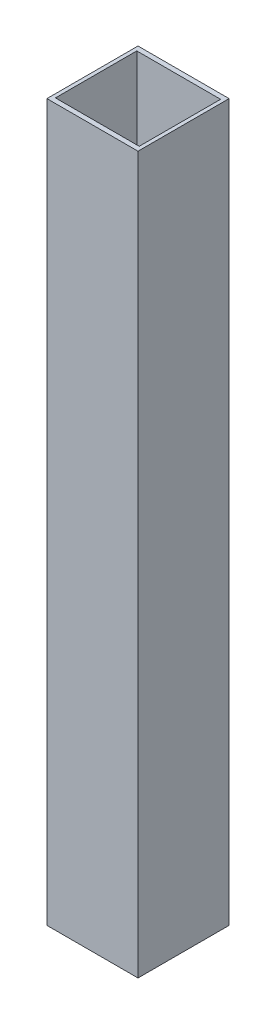
ISO-10303-21;
HEADER;
FILE_DESCRIPTION(('STEP AP214'),'2;1');
FILE_NAME('part.step','',(''),(''),'','','');
FILE_SCHEMA(('AUTOMOTIVE_DESIGN { 1 0 10303 214 1 1 1 1 }'));
ENDSEC;
DATA;
#1=APPLICATION_CONTEXT('core data for automotive mechanical design processes');
#2=APPLICATION_PROTOCOL_DEFINITION('international standard','automotive_design',2000,#1);
#3=PRODUCT_CONTEXT('',#1,'mechanical');
#4=PRODUCT('Part','Part','',(#3));
#5=PRODUCT_RELATED_PRODUCT_CATEGORY('part','',(#4));
#6=PRODUCT_DEFINITION_FORMATION('','',#4);
#7=PRODUCT_DEFINITION_CONTEXT('part definition',#1,'design');
#8=PRODUCT_DEFINITION('design','',#6,#7);
#9=PRODUCT_DEFINITION_SHAPE('','',#8);
#10=(LENGTH_UNIT() NAMED_UNIT(*) SI_UNIT(.MILLI.,.METRE.));
#11=(NAMED_UNIT(*) PLANE_ANGLE_UNIT() SI_UNIT($,.RADIAN.));
#12=(NAMED_UNIT(*) SI_UNIT($,.STERADIAN.) SOLID_ANGLE_UNIT());
#13=UNCERTAINTY_MEASURE_WITH_UNIT(LENGTH_MEASURE(1.E-05),#10,'distance_accuracy_value','');
#14=(GEOMETRIC_REPRESENTATION_CONTEXT(3) GLOBAL_UNCERTAINTY_ASSIGNED_CONTEXT((#13)) GLOBAL_UNIT_ASSIGNED_CONTEXT((#10,
#11,#12)) REPRESENTATION_CONTEXT('',''));
#15=CARTESIAN_POINT('',(0.,0.,0.));
#16=DIRECTION('',(0.,0.,1.));
#17=DIRECTION('',(1.,0.,0.));
#18=AXIS2_PLACEMENT_3D('',#15,#16,#17);
#19=CARTESIAN_POINT('',(0.,117.91,0.));
#20=DIRECTION('',(0.,1.,0.));
#21=DIRECTION('',(0.,0.,1.));
#22=AXIS2_PLACEMENT_3D('',#19,#20,#21);
#23=PLANE('',#22);
#24=DIRECTION('',(0.,0.,1.));
#25=VECTOR('',#24,1.);
#26=CARTESIAN_POINT('',(-7.5,117.91,7.5));
#27=LINE('',#26,#25);
#28=CARTESIAN_POINT('',(-7.5,117.91,-7.5));
#29=VERTEX_POINT('',#28);
#30=CARTESIAN_POINT('',(-7.5,117.91,7.5));
#31=VERTEX_POINT('',#30);
#32=EDGE_CURVE('E135',#29,#31,#27,.T.);
#33=ORIENTED_EDGE('',*,*,#32,.T.);
#34=DIRECTION('',(1.,0.,0.));
#35=VECTOR('',#34,1.);
#36=CARTESIAN_POINT('',(7.5,117.91,7.5));
#37=LINE('',#36,#35);
#38=CARTESIAN_POINT('',(7.5,117.91,7.5));
#39=VERTEX_POINT('',#38);
#40=EDGE_CURVE('E138',#31,#39,#37,.T.);
#41=ORIENTED_EDGE('',*,*,#40,.T.);
#42=DIRECTION('',(0.,0.,-1.));
#43=VECTOR('',#42,1.);
#44=CARTESIAN_POINT('',(7.5,117.91,7.5));
#45=LINE('',#44,#43);
#46=CARTESIAN_POINT('',(7.5,117.91,-7.5));
#47=VERTEX_POINT('',#46);
#48=EDGE_CURVE('E141',#39,#47,#45,.T.);
#49=ORIENTED_EDGE('',*,*,#48,.T.);
#50=DIRECTION('',(-1.,0.,0.));
#51=VECTOR('',#50,1.);
#52=CARTESIAN_POINT('',(7.5,117.91,-7.5));
#53=LINE('',#52,#51);
#54=EDGE_CURVE('E143',#47,#29,#53,.T.);
#55=ORIENTED_EDGE('',*,*,#54,.T.);
#56=EDGE_LOOP('',(#33,#41,#49,#55));
#57=FACE_BOUND('',#56,.T.);
#58=DIRECTION('',(1.,0.,0.));
#59=VECTOR('',#58,1.);
#60=CARTESIAN_POINT('',(6.9,117.91,6.7));
#61=LINE('',#60,#59);
#62=CARTESIAN_POINT('',(-6.9,117.91,6.7));
#63=VERTEX_POINT('',#62);
#64=CARTESIAN_POINT('',(6.9,117.91,6.7));
#65=VERTEX_POINT('',#64);
#66=EDGE_CURVE('E107',#63,#65,#61,.T.);
#67=ORIENTED_EDGE('',*,*,#66,.F.);
#68=DIRECTION('',(0.,0.,1.));
#69=VECTOR('',#68,1.);
#70=CARTESIAN_POINT('',(-6.9,117.91,6.7));
#71=LINE('',#70,#69);
#72=CARTESIAN_POINT('',(-6.9,117.91,-6.7));
#73=VERTEX_POINT('',#72);
#74=EDGE_CURVE('E99',#73,#63,#71,.T.);
#75=ORIENTED_EDGE('',*,*,#74,.F.);
#76=DIRECTION('',(-1.,0.,0.));
#77=VECTOR('',#76,1.);
#78=CARTESIAN_POINT('',(6.9,117.91,-6.7));
#79=LINE('',#78,#77);
#80=CARTESIAN_POINT('',(6.9,117.91,-6.7));
#81=VERTEX_POINT('',#80);
#82=EDGE_CURVE('E121',#81,#73,#79,.T.);
#83=ORIENTED_EDGE('',*,*,#82,.F.);
#84=DIRECTION('',(0.,0.,-1.));
#85=VECTOR('',#84,1.);
#86=CARTESIAN_POINT('',(6.9,117.91,6.7));
#87=LINE('',#86,#85);
#88=EDGE_CURVE('E119',#65,#81,#87,.T.);
#89=ORIENTED_EDGE('',*,*,#88,.F.);
#90=EDGE_LOOP('',(#67,#75,#83,#89));
#91=FACE_BOUND('',#90,.T.);
#92=ADVANCED_FACE('F34',(#57,#91),#23,.T.);
#93=CARTESIAN_POINT('',(0.,0.,0.));
#94=DIRECTION('',(0.,1.,0.));
#95=DIRECTION('',(0.,0.,1.));
#96=AXIS2_PLACEMENT_3D('',#93,#94,#95);
#97=PLANE('',#96);
#98=DIRECTION('',(0.,0.,1.));
#99=VECTOR('',#98,1.);
#100=CARTESIAN_POINT('',(-7.5,0.,7.5));
#101=LINE('',#100,#99);
#102=CARTESIAN_POINT('',(-7.5,0.,-7.5));
#103=VERTEX_POINT('',#102);
#104=CARTESIAN_POINT('',(-7.5,0.,7.5));
#105=VERTEX_POINT('',#104);
#106=EDGE_CURVE('E115',#103,#105,#101,.T.);
#107=ORIENTED_EDGE('',*,*,#106,.F.);
#108=DIRECTION('',(-1.,0.,0.));
#109=VECTOR('',#108,1.);
#110=CARTESIAN_POINT('',(7.5,0.,-7.5));
#111=LINE('',#110,#109);
#112=CARTESIAN_POINT('',(7.5,0.,-7.5));
#113=VERTEX_POINT('',#112);
#114=EDGE_CURVE('E139',#113,#103,#111,.T.);
#115=ORIENTED_EDGE('',*,*,#114,.F.);
#116=DIRECTION('',(0.,0.,-1.));
#117=VECTOR('',#116,1.);
#118=CARTESIAN_POINT('',(7.5,0.,7.5));
#119=LINE('',#118,#117);
#120=CARTESIAN_POINT('',(7.5,0.,7.5));
#121=VERTEX_POINT('',#120);
#122=EDGE_CURVE('E150',#121,#113,#119,.T.);
#123=ORIENTED_EDGE('',*,*,#122,.F.);
#124=DIRECTION('',(1.,0.,0.));
#125=VECTOR('',#124,1.);
#126=CARTESIAN_POINT('',(7.5,0.,7.5));
#127=LINE('',#126,#125);
#128=EDGE_CURVE('E148',#105,#121,#127,.T.);
#129=ORIENTED_EDGE('',*,*,#128,.F.);
#130=EDGE_LOOP('',(#107,#115,#123,#129));
#131=FACE_BOUND('',#130,.T.);
#132=DIRECTION('',(0.,0.,1.));
#133=VECTOR('',#132,1.);
#134=CARTESIAN_POINT('',(-6.9,0.,6.7));
#135=LINE('',#134,#133);
#136=CARTESIAN_POINT('',(-6.9,0.,-6.7));
#137=VERTEX_POINT('',#136);
#138=CARTESIAN_POINT('',(-6.9,0.,6.7));
#139=VERTEX_POINT('',#138);
#140=EDGE_CURVE('E57',#137,#139,#135,.T.);
#141=ORIENTED_EDGE('',*,*,#140,.T.);
#142=DIRECTION('',(1.,0.,0.));
#143=VECTOR('',#142,1.);
#144=CARTESIAN_POINT('',(6.9,0.,6.7));
#145=LINE('',#144,#143);
#146=CARTESIAN_POINT('',(6.9,0.,6.7));
#147=VERTEX_POINT('',#146);
#148=EDGE_CURVE('E114',#139,#147,#145,.T.);
#149=ORIENTED_EDGE('',*,*,#148,.T.);
#150=DIRECTION('',(0.,0.,-1.));
#151=VECTOR('',#150,1.);
#152=CARTESIAN_POINT('',(6.9,0.,6.7));
#153=LINE('',#152,#151);
#154=CARTESIAN_POINT('',(6.9,0.,-6.7));
#155=VERTEX_POINT('',#154);
#156=EDGE_CURVE('E127',#147,#155,#153,.T.);
#157=ORIENTED_EDGE('',*,*,#156,.T.);
#158=DIRECTION('',(-1.,0.,0.));
#159=VECTOR('',#158,1.);
#160=CARTESIAN_POINT('',(6.9,0.,-6.7));
#161=LINE('',#160,#159);
#162=EDGE_CURVE('E108',#155,#137,#161,.T.);
#163=ORIENTED_EDGE('',*,*,#162,.T.);
#164=EDGE_LOOP('',(#141,#149,#157,#163));
#165=FACE_BOUND('',#164,.T.);
#166=ADVANCED_FACE('F168',(#131,#165),#97,.F.);
#167=CARTESIAN_POINT('',(-7.5,117.91,7.5));
#168=DIRECTION('',(1.,0.,0.));
#169=DIRECTION('',(0.,0.,-1.));
#170=AXIS2_PLACEMENT_3D('',#167,#168,#169);
#171=PLANE('',#170);
#172=ORIENTED_EDGE('',*,*,#106,.T.);
#173=DIRECTION('',(0.,-1.,0.));
#174=VECTOR('',#173,1.);
#175=CARTESIAN_POINT('',(-7.5,117.91,7.5));
#176=LINE('',#175,#174);
#177=EDGE_CURVE('E11',#31,#105,#176,.T.);
#178=ORIENTED_EDGE('',*,*,#177,.F.);
#179=ORIENTED_EDGE('',*,*,#32,.F.);
#180=DIRECTION('',(0.,-1.,0.));
#181=VECTOR('',#180,1.);
#182=CARTESIAN_POINT('',(-7.5,117.91,-7.5));
#183=LINE('',#182,#181);
#184=EDGE_CURVE('E145',#29,#103,#183,.T.);
#185=ORIENTED_EDGE('',*,*,#184,.T.);
#186=EDGE_LOOP('',(#172,#178,#179,#185));
#187=FACE_BOUND('',#186,.T.);
#188=ADVANCED_FACE('F36',(#187),#171,.F.);
#189=CARTESIAN_POINT('',(7.5,117.91,7.5));
#190=DIRECTION('',(0.,0.,-1.));
#191=DIRECTION('',(-1.,0.,0.));
#192=AXIS2_PLACEMENT_3D('',#189,#190,#191);
#193=PLANE('',#192);
#194=ORIENTED_EDGE('',*,*,#128,.T.);
#195=DIRECTION('',(0.,-1.,0.));
#196=VECTOR('',#195,1.);
#197=CARTESIAN_POINT('',(7.5,117.91,7.5));
#198=LINE('',#197,#196);
#199=EDGE_CURVE('E42',#39,#121,#198,.T.);
#200=ORIENTED_EDGE('',*,*,#199,.F.);
#201=ORIENTED_EDGE('',*,*,#40,.F.);
#202=ORIENTED_EDGE('',*,*,#177,.T.);
#203=EDGE_LOOP('',(#194,#200,#201,#202));
#204=FACE_BOUND('',#203,.T.);
#205=ADVANCED_FACE('F178',(#204),#193,.F.);
#206=CARTESIAN_POINT('',(7.5,117.91,7.5));
#207=DIRECTION('',(-1.,0.,0.));
#208=DIRECTION('',(0.,0.,1.));
#209=AXIS2_PLACEMENT_3D('',#206,#207,#208);
#210=PLANE('',#209);
#211=ORIENTED_EDGE('',*,*,#122,.T.);
#212=DIRECTION('',(0.,-1.,0.));
#213=VECTOR('',#212,1.);
#214=CARTESIAN_POINT('',(7.5,117.91,-7.5));
#215=LINE('',#214,#213);
#216=EDGE_CURVE('E155',#47,#113,#215,.T.);
#217=ORIENTED_EDGE('',*,*,#216,.F.);
#218=ORIENTED_EDGE('',*,*,#48,.F.);
#219=ORIENTED_EDGE('',*,*,#199,.T.);
#220=EDGE_LOOP('',(#211,#217,#218,#219));
#221=FACE_BOUND('',#220,.T.);
#222=ADVANCED_FACE('F162',(#221),#210,.F.);
#223=CARTESIAN_POINT('',(7.5,117.91,-7.5));
#224=DIRECTION('',(0.,0.,1.));
#225=DIRECTION('',(1.,0.,0.));
#226=AXIS2_PLACEMENT_3D('',#223,#224,#225);
#227=PLANE('',#226);
#228=ORIENTED_EDGE('',*,*,#114,.T.);
#229=ORIENTED_EDGE('',*,*,#184,.F.);
#230=ORIENTED_EDGE('',*,*,#54,.F.);
#231=ORIENTED_EDGE('',*,*,#216,.T.);
#232=EDGE_LOOP('',(#228,#229,#230,#231));
#233=FACE_BOUND('',#232,.T.);
#234=ADVANCED_FACE('F172',(#233),#227,.F.);
#235=CARTESIAN_POINT('',(-6.9,117.91,6.7));
#236=DIRECTION('',(1.,0.,0.));
#237=DIRECTION('',(0.,0.,-1.));
#238=AXIS2_PLACEMENT_3D('',#235,#236,#237);
#239=PLANE('',#238);
#240=ORIENTED_EDGE('',*,*,#140,.F.);
#241=DIRECTION('',(0.,-1.,0.));
#242=VECTOR('',#241,1.);
#243=CARTESIAN_POINT('',(-6.9,117.91,-6.7));
#244=LINE('',#243,#242);
#245=EDGE_CURVE('E103',#73,#137,#244,.T.);
#246=ORIENTED_EDGE('',*,*,#245,.F.);
#247=ORIENTED_EDGE('',*,*,#74,.T.);
#248=DIRECTION('',(0.,-1.,0.));
#249=VECTOR('',#248,1.);
#250=CARTESIAN_POINT('',(-6.9,117.91,6.7));
#251=LINE('',#250,#249);
#252=EDGE_CURVE('E102',#63,#139,#251,.T.);
#253=ORIENTED_EDGE('',*,*,#252,.T.);
#254=EDGE_LOOP('',(#240,#246,#247,#253));
#255=FACE_BOUND('',#254,.T.);
#256=ADVANCED_FACE('F101',(#255),#239,.T.);
#257=CARTESIAN_POINT('',(6.9,117.91,6.7));
#258=DIRECTION('',(0.,0.,-1.));
#259=DIRECTION('',(-1.,0.,0.));
#260=AXIS2_PLACEMENT_3D('',#257,#258,#259);
#261=PLANE('',#260);
#262=ORIENTED_EDGE('',*,*,#148,.F.);
#263=ORIENTED_EDGE('',*,*,#252,.F.);
#264=ORIENTED_EDGE('',*,*,#66,.T.);
#265=DIRECTION('',(0.,-1.,0.));
#266=VECTOR('',#265,1.);
#267=CARTESIAN_POINT('',(6.9,117.91,6.7));
#268=LINE('',#267,#266);
#269=EDGE_CURVE('E116',#65,#147,#268,.T.);
#270=ORIENTED_EDGE('',*,*,#269,.T.);
#271=EDGE_LOOP('',(#262,#263,#264,#270));
#272=FACE_BOUND('',#271,.T.);
#273=ADVANCED_FACE('F111',(#272),#261,.T.);
#274=CARTESIAN_POINT('',(6.9,117.91,6.7));
#275=DIRECTION('',(-1.,0.,0.));
#276=DIRECTION('',(0.,0.,1.));
#277=AXIS2_PLACEMENT_3D('',#274,#275,#276);
#278=PLANE('',#277);
#279=ORIENTED_EDGE('',*,*,#156,.F.);
#280=ORIENTED_EDGE('',*,*,#269,.F.);
#281=ORIENTED_EDGE('',*,*,#88,.T.);
#282=DIRECTION('',(0.,-1.,0.));
#283=VECTOR('',#282,1.);
#284=CARTESIAN_POINT('',(6.9,117.91,-6.7));
#285=LINE('',#284,#283);
#286=EDGE_CURVE('E49',#81,#155,#285,.T.);
#287=ORIENTED_EDGE('',*,*,#286,.T.);
#288=EDGE_LOOP('',(#279,#280,#281,#287));
#289=FACE_BOUND('',#288,.T.);
#290=ADVANCED_FACE('F201',(#289),#278,.T.);
#291=CARTESIAN_POINT('',(6.9,117.91,-6.7));
#292=DIRECTION('',(0.,0.,1.));
#293=DIRECTION('',(1.,0.,0.));
#294=AXIS2_PLACEMENT_3D('',#291,#292,#293);
#295=PLANE('',#294);
#296=ORIENTED_EDGE('',*,*,#162,.F.);
#297=ORIENTED_EDGE('',*,*,#286,.F.);
#298=ORIENTED_EDGE('',*,*,#82,.T.);
#299=ORIENTED_EDGE('',*,*,#245,.T.);
#300=EDGE_LOOP('',(#296,#297,#298,#299));
#301=FACE_BOUND('',#300,.T.);
#302=ADVANCED_FACE('F205',(#301),#295,.T.);
#303=CLOSED_SHELL('',(#92,#166,#188,#205,#222,#234,#256,#273,#290,#302));
#304=MANIFOLD_SOLID_BREP('B2',#303);
#305=ADVANCED_BREP_SHAPE_REPRESENTATION('',(#18,#304),#14);
#306=SHAPE_DEFINITION_REPRESENTATION(#9,#305);
ENDSEC;
END-ISO-10303-21;
